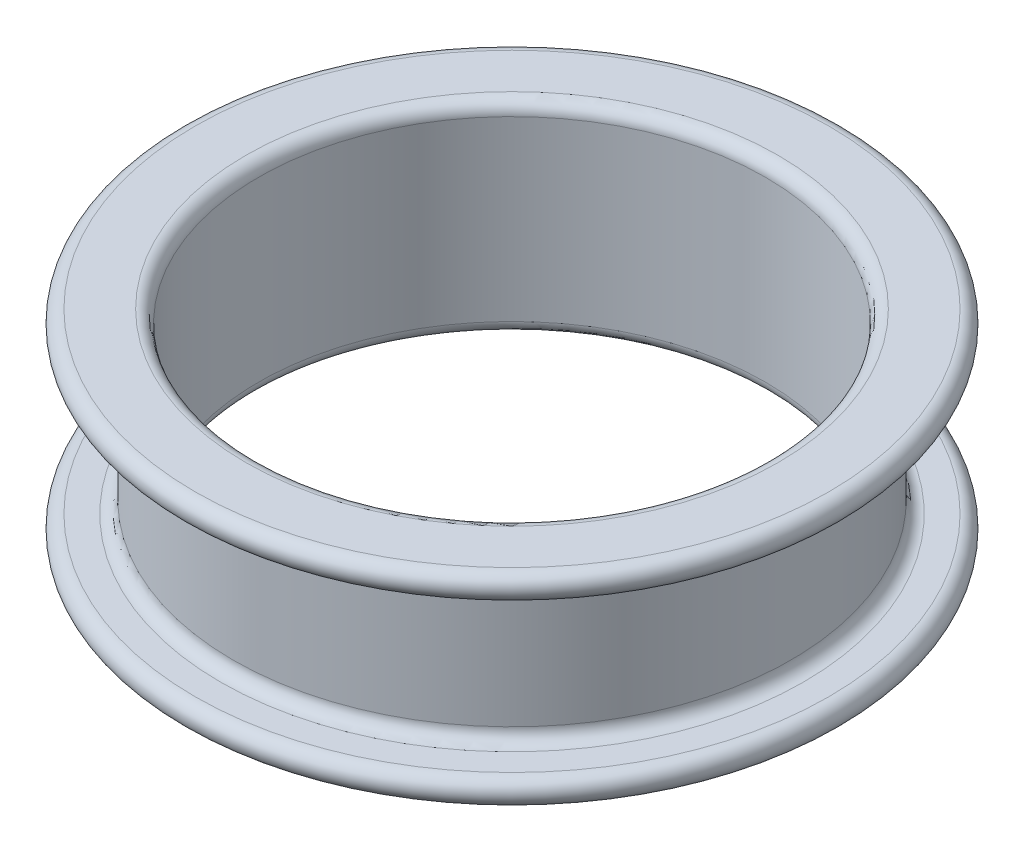
ISO-10303-21;
HEADER;
FILE_DESCRIPTION(('STEP AP214'),'2;1');
FILE_NAME('part.step','',(''),(''),'','','');
FILE_SCHEMA(('AUTOMOTIVE_DESIGN { 1 0 10303 214 1 1 1 1 }'));
ENDSEC;
DATA;
#1=APPLICATION_CONTEXT('core data for automotive mechanical design processes');
#2=APPLICATION_PROTOCOL_DEFINITION('international standard','automotive_design',2000,#1);
#3=PRODUCT_CONTEXT('',#1,'mechanical');
#4=PRODUCT('Part','Part','',(#3));
#5=PRODUCT_RELATED_PRODUCT_CATEGORY('part','',(#4));
#6=PRODUCT_DEFINITION_FORMATION('','',#4);
#7=PRODUCT_DEFINITION_CONTEXT('part definition',#1,'design');
#8=PRODUCT_DEFINITION('design','',#6,#7);
#9=PRODUCT_DEFINITION_SHAPE('','',#8);
#10=(LENGTH_UNIT() NAMED_UNIT(*) SI_UNIT(.MILLI.,.METRE.));
#11=(NAMED_UNIT(*) PLANE_ANGLE_UNIT() SI_UNIT($,.RADIAN.));
#12=(NAMED_UNIT(*) SI_UNIT($,.STERADIAN.) SOLID_ANGLE_UNIT());
#13=UNCERTAINTY_MEASURE_WITH_UNIT(LENGTH_MEASURE(1.E-05),#10,'distance_accuracy_value','');
#14=(GEOMETRIC_REPRESENTATION_CONTEXT(3) GLOBAL_UNCERTAINTY_ASSIGNED_CONTEXT((#13)) GLOBAL_UNIT_ASSIGNED_CONTEXT((#10,
#11,#12)) REPRESENTATION_CONTEXT('',''));
#15=CARTESIAN_POINT('',(0.,0.,0.));
#16=DIRECTION('',(0.,0.,1.));
#17=DIRECTION('',(1.,0.,0.));
#18=AXIS2_PLACEMENT_3D('',#15,#16,#17);
#19=CARTESIAN_POINT('',(0.,-3.5,0.));
#20=DIRECTION('',(0.,-1.,0.));
#21=DIRECTION('',(0.,0.,-1.));
#22=AXIS2_PLACEMENT_3D('',#19,#20,#21);
#23=TOROIDAL_SURFACE('',#22,12.5,0.5);
#24=CARTESIAN_POINT('',(0.,-3.,0.));
#25=DIRECTION('',(0.,-1.,0.));
#26=DIRECTION('',(0.,0.,-1.));
#27=AXIS2_PLACEMENT_3D('',#24,#25,#26);
#28=CIRCLE('',#27,12.5);
#29=CARTESIAN_POINT('',(0.,-3.,-12.5));
#30=VERTEX_POINT('',#29);
#31=EDGE_CURVE('E48',#30,#30,#28,.F.);
#32=ORIENTED_EDGE('',*,*,#31,.F.);
#33=EDGE_LOOP('',(#32));
#34=FACE_BOUND('',#33,.T.);
#35=CARTESIAN_POINT('',(0.,-4.,0.));
#36=DIRECTION('',(0.,1.,0.));
#37=DIRECTION('',(0.,0.,1.));
#38=AXIS2_PLACEMENT_3D('',#35,#36,#37);
#39=CIRCLE('',#38,12.5);
#40=CARTESIAN_POINT('',(0.,-4.,12.5));
#41=VERTEX_POINT('',#40);
#42=EDGE_CURVE('E10',#41,#41,#39,.F.);
#43=ORIENTED_EDGE('',*,*,#42,.F.);
#44=EDGE_LOOP('',(#43));
#45=FACE_BOUND('',#44,.T.);
#46=ADVANCED_FACE('F41',(#34,#45),#23,.T.);
#47=CARTESIAN_POINT('',(0.,3.5,0.));
#48=DIRECTION('',(0.,-1.,0.));
#49=DIRECTION('',(0.,0.,-1.));
#50=AXIS2_PLACEMENT_3D('',#47,#48,#49);
#51=TOROIDAL_SURFACE('',#50,12.5,0.500000000000001);
#52=CARTESIAN_POINT('',(0.,4.,0.));
#53=DIRECTION('',(0.,-1.,0.));
#54=DIRECTION('',(0.,0.,-1.));
#55=AXIS2_PLACEMENT_3D('',#52,#53,#54);
#56=CIRCLE('',#55,12.5);
#57=CARTESIAN_POINT('',(0.,4.,-12.5));
#58=VERTEX_POINT('',#57);
#59=EDGE_CURVE('E57',#58,#58,#56,.F.);
#60=ORIENTED_EDGE('',*,*,#59,.F.);
#61=EDGE_LOOP('',(#60));
#62=FACE_BOUND('',#61,.T.);
#63=CARTESIAN_POINT('',(0.,3.,0.));
#64=DIRECTION('',(0.,1.,0.));
#65=DIRECTION('',(0.,0.,1.));
#66=AXIS2_PLACEMENT_3D('',#63,#64,#65);
#67=CIRCLE('',#66,12.5);
#68=CARTESIAN_POINT('',(0.,3.,12.5));
#69=VERTEX_POINT('',#68);
#70=EDGE_CURVE('E55',#69,#69,#67,.F.);
#71=ORIENTED_EDGE('',*,*,#70,.F.);
#72=EDGE_LOOP('',(#71));
#73=FACE_BOUND('',#72,.T.);
#74=ADVANCED_FACE('F107',(#62,#73),#51,.T.);
#75=CARTESIAN_POINT('',(0.,-17.2756697847607,0.));
#76=DIRECTION('',(0.,-1.,0.));
#77=DIRECTION('',(0.,0.,-1.));
#78=AXIS2_PLACEMENT_3D('',#75,#76,#77);
#79=CYLINDRICAL_SURFACE('',#78,10.);
#80=CARTESIAN_POINT('',(0.,3.5,0.));
#81=DIRECTION('',(0.,-1.,0.));
#82=DIRECTION('',(0.,0.,-1.));
#83=AXIS2_PLACEMENT_3D('',#80,#81,#82);
#84=CIRCLE('',#83,10.);
#85=CARTESIAN_POINT('',(0.,3.5,-10.));
#86=VERTEX_POINT('',#85);
#87=EDGE_CURVE('E67',#86,#86,#84,.F.);
#88=ORIENTED_EDGE('',*,*,#87,.T.);
#89=EDGE_LOOP('',(#88));
#90=FACE_BOUND('',#89,.T.);
#91=CARTESIAN_POINT('',(0.,-3.5,0.));
#92=DIRECTION('',(0.,1.,0.));
#93=DIRECTION('',(0.,0.,1.));
#94=AXIS2_PLACEMENT_3D('',#91,#92,#93);
#95=CIRCLE('',#94,10.);
#96=CARTESIAN_POINT('',(0.,-3.5,10.));
#97=VERTEX_POINT('',#96);
#98=EDGE_CURVE('E70',#97,#97,#95,.F.);
#99=ORIENTED_EDGE('',*,*,#98,.T.);
#100=EDGE_LOOP('',(#99));
#101=FACE_BOUND('',#100,.T.);
#102=ADVANCED_FACE('F111',(#90,#101),#79,.F.);
#103=CARTESIAN_POINT('',(0.,-4.,10.));
#104=DIRECTION('',(0.,1.,0.));
#105=DIRECTION('',(0.,0.,1.));
#106=AXIS2_PLACEMENT_3D('',#103,#104,#105);
#107=PLANE('',#106);
#108=ORIENTED_EDGE('',*,*,#42,.T.);
#109=EDGE_LOOP('',(#108));
#110=FACE_BOUND('',#109,.T.);
#111=CARTESIAN_POINT('',(0.,-4.,0.));
#112=DIRECTION('',(0.,1.,0.));
#113=DIRECTION('',(0.,0.,1.));
#114=AXIS2_PLACEMENT_3D('',#111,#112,#113);
#115=CIRCLE('',#114,10.5);
#116=CARTESIAN_POINT('',(0.,-4.,10.5));
#117=VERTEX_POINT('',#116);
#118=EDGE_CURVE('E61',#117,#117,#115,.T.);
#119=ORIENTED_EDGE('',*,*,#118,.T.);
#120=EDGE_LOOP('',(#119));
#121=FACE_BOUND('',#120,.T.);
#122=ADVANCED_FACE('F122',(#110,#121),#107,.F.);
#123=CARTESIAN_POINT('',(0.,-3.,13.));
#124=DIRECTION('',(0.,-1.,0.));
#125=DIRECTION('',(0.,0.,-1.));
#126=AXIS2_PLACEMENT_3D('',#123,#124,#125);
#127=PLANE('',#126);
#128=ORIENTED_EDGE('',*,*,#31,.T.);
#129=EDGE_LOOP('',(#128));
#130=FACE_BOUND('',#129,.T.);
#131=CARTESIAN_POINT('',(0.,-3.,0.));
#132=DIRECTION('',(0.,-1.,0.));
#133=DIRECTION('',(0.,0.,-1.));
#134=AXIS2_PLACEMENT_3D('',#131,#132,#133);
#135=CIRCLE('',#134,11.5);
#136=CARTESIAN_POINT('',(0.,-3.,-11.5));
#137=VERTEX_POINT('',#136);
#138=EDGE_CURVE('E84',#137,#137,#135,.T.);
#139=ORIENTED_EDGE('',*,*,#138,.T.);
#140=EDGE_LOOP('',(#139));
#141=FACE_BOUND('',#140,.T.);
#142=ADVANCED_FACE('F88',(#130,#141),#127,.F.);
#143=CARTESIAN_POINT('',(0.,-17.2756697847607,0.));
#144=DIRECTION('',(0.,-1.,0.));
#145=DIRECTION('',(0.,0.,-1.));
#146=AXIS2_PLACEMENT_3D('',#143,#144,#145);
#147=CYLINDRICAL_SURFACE('',#146,11.);
#148=CARTESIAN_POINT('',(0.,-2.5,0.));
#149=DIRECTION('',(0.,-1.,0.));
#150=DIRECTION('',(0.,0.,-1.));
#151=AXIS2_PLACEMENT_3D('',#148,#149,#150);
#152=CIRCLE('',#151,11.);
#153=CARTESIAN_POINT('',(0.,-2.5,-11.));
#154=VERTEX_POINT('',#153);
#155=EDGE_CURVE('E76',#154,#154,#152,.F.);
#156=ORIENTED_EDGE('',*,*,#155,.T.);
#157=EDGE_LOOP('',(#156));
#158=FACE_BOUND('',#157,.T.);
#159=CARTESIAN_POINT('',(0.,2.5,0.));
#160=DIRECTION('',(0.,1.,0.));
#161=DIRECTION('',(0.,0.,1.));
#162=AXIS2_PLACEMENT_3D('',#159,#160,#161);
#163=CIRCLE('',#162,11.);
#164=CARTESIAN_POINT('',(0.,2.5,11.));
#165=VERTEX_POINT('',#164);
#166=EDGE_CURVE('E78',#165,#165,#163,.F.);
#167=ORIENTED_EDGE('',*,*,#166,.T.);
#168=EDGE_LOOP('',(#167));
#169=FACE_BOUND('',#168,.T.);
#170=ADVANCED_FACE('F143',(#158,#169),#147,.T.);
#171=CARTESIAN_POINT('',(0.,3.,11.));
#172=DIRECTION('',(0.,1.,0.));
#173=DIRECTION('',(0.,0.,1.));
#174=AXIS2_PLACEMENT_3D('',#171,#172,#173);
#175=PLANE('',#174);
#176=ORIENTED_EDGE('',*,*,#70,.T.);
#177=EDGE_LOOP('',(#176));
#178=FACE_BOUND('',#177,.T.);
#179=CARTESIAN_POINT('',(0.,3.,0.));
#180=DIRECTION('',(0.,1.,0.));
#181=DIRECTION('',(0.,0.,1.));
#182=AXIS2_PLACEMENT_3D('',#179,#180,#181);
#183=CIRCLE('',#182,11.5);
#184=CARTESIAN_POINT('',(0.,3.,11.5));
#185=VERTEX_POINT('',#184);
#186=EDGE_CURVE('E63',#185,#185,#183,.T.);
#187=ORIENTED_EDGE('',*,*,#186,.T.);
#188=EDGE_LOOP('',(#187));
#189=FACE_BOUND('',#188,.T.);
#190=ADVANCED_FACE('F105',(#178,#189),#175,.F.);
#191=CARTESIAN_POINT('',(0.,4.,13.));
#192=DIRECTION('',(0.,-1.,0.));
#193=DIRECTION('',(0.,0.,-1.));
#194=AXIS2_PLACEMENT_3D('',#191,#192,#193);
#195=PLANE('',#194);
#196=ORIENTED_EDGE('',*,*,#59,.T.);
#197=EDGE_LOOP('',(#196));
#198=FACE_BOUND('',#197,.T.);
#199=CARTESIAN_POINT('',(0.,4.,0.));
#200=DIRECTION('',(0.,-1.,0.));
#201=DIRECTION('',(0.,0.,-1.));
#202=AXIS2_PLACEMENT_3D('',#199,#200,#201);
#203=CIRCLE('',#202,10.5);
#204=CARTESIAN_POINT('',(0.,4.,-10.5));
#205=VERTEX_POINT('',#204);
#206=EDGE_CURVE('E71',#205,#205,#203,.T.);
#207=ORIENTED_EDGE('',*,*,#206,.T.);
#208=EDGE_LOOP('',(#207));
#209=FACE_BOUND('',#208,.T.);
#210=ADVANCED_FACE('F93',(#198,#209),#195,.F.);
#211=CARTESIAN_POINT('',(0.,-2.5,0.));
#212=DIRECTION('',(0.,-1.,0.));
#213=DIRECTION('',(0.,0.,-1.));
#214=AXIS2_PLACEMENT_3D('',#211,#212,#213);
#215=TOROIDAL_SURFACE('',#214,11.5,0.5);
#216=ORIENTED_EDGE('',*,*,#155,.F.);
#217=EDGE_LOOP('',(#216));
#218=FACE_BOUND('',#217,.T.);
#219=ORIENTED_EDGE('',*,*,#138,.F.);
#220=EDGE_LOOP('',(#219));
#221=FACE_BOUND('',#220,.T.);
#222=ADVANCED_FACE('F86',(#218,#221),#215,.F.);
#223=CARTESIAN_POINT('',(0.,3.5,0.));
#224=DIRECTION('',(0.,-1.,0.));
#225=DIRECTION('',(0.,0.,-1.));
#226=AXIS2_PLACEMENT_3D('',#223,#224,#225);
#227=TOROIDAL_SURFACE('',#226,10.5,0.5);
#228=ORIENTED_EDGE('',*,*,#87,.F.);
#229=EDGE_LOOP('',(#228));
#230=FACE_BOUND('',#229,.T.);
#231=ORIENTED_EDGE('',*,*,#206,.F.);
#232=EDGE_LOOP('',(#231));
#233=FACE_BOUND('',#232,.T.);
#234=ADVANCED_FACE('F89',(#230,#233),#227,.T.);
#235=CARTESIAN_POINT('',(0.,2.5,0.));
#236=DIRECTION('',(0.,1.,0.));
#237=DIRECTION('',(0.,0.,1.));
#238=AXIS2_PLACEMENT_3D('',#235,#236,#237);
#239=TOROIDAL_SURFACE('',#238,11.5,0.5);
#240=ORIENTED_EDGE('',*,*,#186,.F.);
#241=EDGE_LOOP('',(#240));
#242=FACE_BOUND('',#241,.T.);
#243=ORIENTED_EDGE('',*,*,#166,.F.);
#244=EDGE_LOOP('',(#243));
#245=FACE_BOUND('',#244,.T.);
#246=ADVANCED_FACE('F98',(#242,#245),#239,.F.);
#247=CARTESIAN_POINT('',(0.,-3.5,0.));
#248=DIRECTION('',(0.,1.,0.));
#249=DIRECTION('',(0.,0.,1.));
#250=AXIS2_PLACEMENT_3D('',#247,#248,#249);
#251=TOROIDAL_SURFACE('',#250,10.5,0.5);
#252=ORIENTED_EDGE('',*,*,#118,.F.);
#253=EDGE_LOOP('',(#252));
#254=FACE_BOUND('',#253,.T.);
#255=ORIENTED_EDGE('',*,*,#98,.F.);
#256=EDGE_LOOP('',(#255));
#257=FACE_BOUND('',#256,.T.);
#258=ADVANCED_FACE('F128',(#254,#257),#251,.T.);
#259=CLOSED_SHELL('',(#46,#74,#102,#122,#142,#170,#190,#210,#222,#234,#246,#258));
#260=MANIFOLD_SOLID_BREP('B2',#259);
#261=ADVANCED_BREP_SHAPE_REPRESENTATION('',(#18,#260),#14);
#262=SHAPE_DEFINITION_REPRESENTATION(#9,#261);
ENDSEC;
END-ISO-10303-21;
